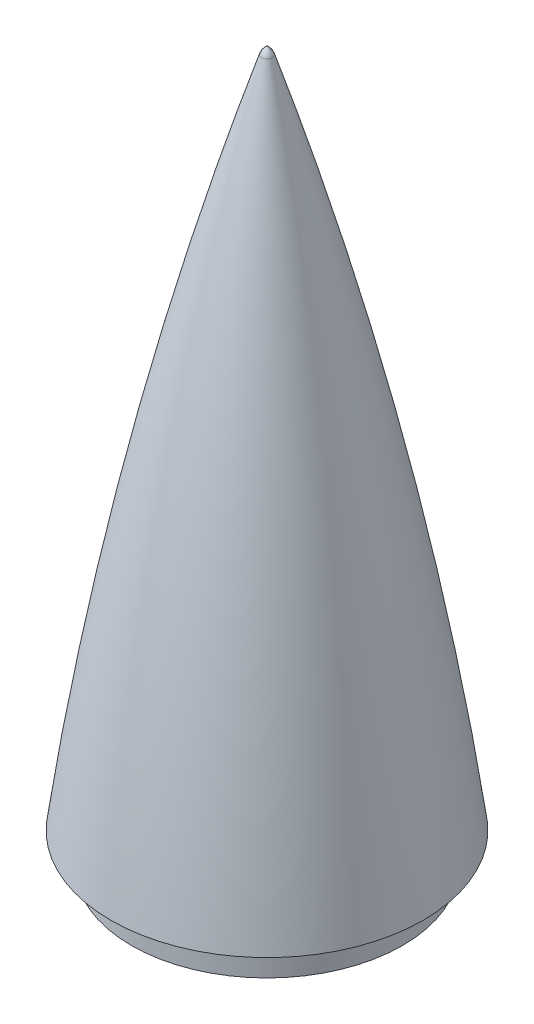
ISO-10303-21;
HEADER;
FILE_DESCRIPTION(('STEP AP214'),'2;1');
FILE_NAME('part.step','',(''),(''),'','','');
FILE_SCHEMA(('AUTOMOTIVE_DESIGN { 1 0 10303 214 1 1 1 1 }'));
ENDSEC;
DATA;
#1=APPLICATION_CONTEXT('core data for automotive mechanical design processes');
#2=APPLICATION_PROTOCOL_DEFINITION('international standard','automotive_design',2000,#1);
#3=PRODUCT_CONTEXT('',#1,'mechanical');
#4=PRODUCT('Part','Part','',(#3));
#5=PRODUCT_RELATED_PRODUCT_CATEGORY('part','',(#4));
#6=PRODUCT_DEFINITION_FORMATION('','',#4);
#7=PRODUCT_DEFINITION_CONTEXT('part definition',#1,'design');
#8=PRODUCT_DEFINITION('design','',#6,#7);
#9=PRODUCT_DEFINITION_SHAPE('','',#8);
#10=(LENGTH_UNIT() NAMED_UNIT(*) SI_UNIT(.MILLI.,.METRE.));
#11=(NAMED_UNIT(*) PLANE_ANGLE_UNIT() SI_UNIT($,.RADIAN.));
#12=(NAMED_UNIT(*) SI_UNIT($,.STERADIAN.) SOLID_ANGLE_UNIT());
#13=UNCERTAINTY_MEASURE_WITH_UNIT(LENGTH_MEASURE(1.E-05),#10,'distance_accuracy_value','');
#14=(GEOMETRIC_REPRESENTATION_CONTEXT(3) GLOBAL_UNCERTAINTY_ASSIGNED_CONTEXT((#13)) GLOBAL_UNIT_ASSIGNED_CONTEXT((#10,
#11,#12)) REPRESENTATION_CONTEXT('',''));
#15=CARTESIAN_POINT('',(0.,0.,0.));
#16=DIRECTION('',(0.,0.,1.));
#17=DIRECTION('',(1.,0.,0.));
#18=AXIS2_PLACEMENT_3D('',#15,#16,#17);
#19=CARTESIAN_POINT('',(0.,0.,0.));
#20=DIRECTION('',(0.,-1.,0.));
#21=DIRECTION('',(0.,0.,-1.));
#22=AXIS2_PLACEMENT_3D('',#19,#20,#21);
#23=DEGENERATE_TOROIDAL_SURFACE('',#22,1001.60919402985,1052.66319402985,.F.);
#24=CARTESIAN_POINT('',(0.,140.208,0.));
#25=DIRECTION('',(0.,-1.,0.));
#26=DIRECTION('',(0.,0.,-1.));
#27=AXIS2_PLACEMENT_3D('',#24,#25,#26);
#28=CIRCLE('',#27,41.674811790773);
#29=CARTESIAN_POINT('',(0.,140.208,-41.674811790773));
#30=VERTEX_POINT('',#29);
#31=EDGE_CURVE('E72',#30,#30,#28,.T.);
#32=ORIENTED_EDGE('',*,*,#31,.F.);
#33=EDGE_LOOP('',(#32));
#34=FACE_BOUND('',#33,.T.);
#35=CARTESIAN_POINT('',(0.,319.344549981105,0.));
#36=DIRECTION('',(0.,-1.,0.));
#37=DIRECTION('',(0.,0.,-1.));
#38=AXIS2_PLACEMENT_3D('',#35,#36,#37);
#39=CIRCLE('',#38,1.44556941155394);
#40=CARTESIAN_POINT('',(0.,319.344549981105,-1.44556941155394));
#41=VERTEX_POINT('',#40);
#42=EDGE_CURVE('E59',#41,#41,#39,.T.);
#43=ORIENTED_EDGE('',*,*,#42,.T.);
#44=EDGE_LOOP('',(#43));
#45=FACE_BOUND('',#44,.T.);
#46=ADVANCED_FACE('F34',(#34,#45),#23,.F.);
#47=CARTESIAN_POINT('',(0.,140.208,39.1119210511566));
#48=DIRECTION('',(0.,1.,0.));
#49=DIRECTION('',(0.,0.,1.));
#50=AXIS2_PLACEMENT_3D('',#47,#48,#49);
#51=PLANE('',#50);
#52=CARTESIAN_POINT('',(0.,140.208,0.));
#53=DIRECTION('',(0.,1.,0.));
#54=DIRECTION('',(0.,0.,1.));
#55=AXIS2_PLACEMENT_3D('',#52,#53,#54);
#56=CIRCLE('',#55,36.9169565238954);
#57=CARTESIAN_POINT('',(0.,140.208,36.9169565238954));
#58=VERTEX_POINT('',#57);
#59=EDGE_CURVE('E11',#58,#58,#56,.T.);
#60=ORIENTED_EDGE('',*,*,#59,.T.);
#61=EDGE_LOOP('',(#60));
#62=FACE_BOUND('',#61,.T.);
#63=ORIENTED_EDGE('',*,*,#31,.T.);
#64=EDGE_LOOP('',(#63));
#65=FACE_BOUND('',#64,.T.);
#66=ADVANCED_FACE('F89',(#62,#65),#51,.F.);
#67=CARTESIAN_POINT('',(0.,0.,0.));
#68=DIRECTION('',(0.,-1.,0.));
#69=DIRECTION('',(0.,0.,-1.));
#70=AXIS2_PLACEMENT_3D('',#67,#68,#69);
#71=CYLINDRICAL_SURFACE('',#70,36.1549565238954);
#72=CARTESIAN_POINT('',(0.,139.446,0.));
#73=DIRECTION('',(0.,1.,0.));
#74=DIRECTION('',(0.,0.,1.));
#75=AXIS2_PLACEMENT_3D('',#72,#73,#74);
#76=CIRCLE('',#75,36.1549565238954);
#77=CARTESIAN_POINT('',(0.,139.446,36.1549565238954));
#78=VERTEX_POINT('',#77);
#79=EDGE_CURVE('E42',#78,#78,#76,.F.);
#80=ORIENTED_EDGE('',*,*,#79,.T.);
#81=EDGE_LOOP('',(#80));
#82=FACE_BOUND('',#81,.T.);
#83=CARTESIAN_POINT('',(0.,131.601387737431,0.));
#84=DIRECTION('',(0.,-1.,0.));
#85=DIRECTION('',(0.,0.,-1.));
#86=AXIS2_PLACEMENT_3D('',#83,#84,#85);
#87=CIRCLE('',#86,36.1549565238954);
#88=CARTESIAN_POINT('',(0.,131.601387737431,-36.1549565238954));
#89=VERTEX_POINT('',#88);
#90=EDGE_CURVE('E69',#89,#89,#87,.T.);
#91=ORIENTED_EDGE('',*,*,#90,.F.);
#92=EDGE_LOOP('',(#91));
#93=FACE_BOUND('',#92,.T.);
#94=ADVANCED_FACE('F77',(#82,#93),#71,.T.);
#95=CARTESIAN_POINT('',(0.,131.601387737431,36.1549565238954));
#96=DIRECTION('',(0.,1.,0.));
#97=DIRECTION('',(0.,0.,1.));
#98=AXIS2_PLACEMENT_3D('',#95,#96,#97);
#99=PLANE('',#98);
#100=CARTESIAN_POINT('',(0.,131.601387737431,0.));
#101=DIRECTION('',(0.,-1.,0.));
#102=DIRECTION('',(0.,0.,-1.));
#103=AXIS2_PLACEMENT_3D('',#100,#101,#102);
#104=CIRCLE('',#103,33.6149565238954);
#105=CARTESIAN_POINT('',(0.,131.601387737431,-33.6149565238954));
#106=VERTEX_POINT('',#105);
#107=EDGE_CURVE('E62',#106,#106,#104,.T.);
#108=ORIENTED_EDGE('',*,*,#107,.F.);
#109=EDGE_LOOP('',(#108));
#110=FACE_BOUND('',#109,.T.);
#111=ORIENTED_EDGE('',*,*,#90,.T.);
#112=EDGE_LOOP('',(#111));
#113=FACE_BOUND('',#112,.T.);
#114=ADVANCED_FACE('F101',(#110,#113),#99,.F.);
#115=CARTESIAN_POINT('',(0.,0.,0.));
#116=DIRECTION('',(0.,-1.,0.));
#117=DIRECTION('',(0.,0.,-1.));
#118=AXIS2_PLACEMENT_3D('',#115,#116,#117);
#119=CYLINDRICAL_SURFACE('',#118,33.6149565238954);
#120=CARTESIAN_POINT('',(0.,142.748,0.));
#121=DIRECTION('',(0.,-1.,0.));
#122=DIRECTION('',(0.,0.,-1.));
#123=AXIS2_PLACEMENT_3D('',#120,#121,#122);
#124=CIRCLE('',#123,33.6149565238954);
#125=CARTESIAN_POINT('',(0.,142.748,-33.6149565238954));
#126=VERTEX_POINT('',#125);
#127=EDGE_CURVE('E58',#126,#126,#124,.T.);
#128=ORIENTED_EDGE('',*,*,#127,.F.);
#129=EDGE_LOOP('',(#128));
#130=FACE_BOUND('',#129,.T.);
#131=ORIENTED_EDGE('',*,*,#107,.T.);
#132=EDGE_LOOP('',(#131));
#133=FACE_BOUND('',#132,.T.);
#134=ADVANCED_FACE('F104',(#130,#133),#119,.F.);
#135=CARTESIAN_POINT('',(0.,142.748,0.));
#136=DIRECTION('',(0.,1.,0.));
#137=DIRECTION('',(0.,0.,1.));
#138=AXIS2_PLACEMENT_3D('',#135,#136,#137);
#139=CONICAL_SURFACE('',#138,33.6149565238954,1.04719755119663);
#140=CARTESIAN_POINT('',(0.,145.501978469614,0.));
#141=DIRECTION('',(0.,-1.,0.));
#142=DIRECTION('',(0.,0.,-1.));
#143=AXIS2_PLACEMENT_3D('',#140,#141,#142);
#144=CIRCLE('',#143,38.3849871562189);
#145=CARTESIAN_POINT('',(0.,145.501978469614,-38.3849871562189));
#146=VERTEX_POINT('',#145);
#147=EDGE_CURVE('E56',#146,#146,#144,.T.);
#148=ORIENTED_EDGE('',*,*,#147,.F.);
#149=EDGE_LOOP('',(#148));
#150=FACE_BOUND('',#149,.T.);
#151=ORIENTED_EDGE('',*,*,#127,.T.);
#152=EDGE_LOOP('',(#151));
#153=FACE_BOUND('',#152,.T.);
#154=ADVANCED_FACE('F52',(#150,#153),#139,.F.);
#155=CARTESIAN_POINT('',(0.,0.,1001.60919402985));
#156=DIRECTION('',(-1.,0.,0.));
#157=DIRECTION('',(0.,0.,-1.));
#158=AXIS2_PLACEMENT_3D('',#155,#156,#157);
#159=CIRCLE('',#158,1050.12319402985);
#160=TRIMMED_CURVE('',#159,(PARAMETER_VALUE(-0.305150955397003)),
(PARAMETER_VALUE(0.305150955397003)),.T.,.PARAMETER.);
#161=CARTESIAN_POINT('',(0.,0.,0.));
#162=DIRECTION('',(0.,-1.,0.));
#163=AXIS1_PLACEMENT('',#161,#162);
#164=SURFACE_OF_REVOLUTION('',#160,#163);
#165=CARTESIAN_POINT('',(0.,315.496030203754,2.22044604925031E-13));
#166=VERTEX_POINT('',#165);
#167=VERTEX_LOOP('',#166);
#168=FACE_BOUND('',#167,.T.);
#169=ORIENTED_EDGE('',*,*,#147,.T.);
#170=EDGE_LOOP('',(#169));
#171=FACE_BOUND('',#170,.T.);
#172=ADVANCED_FACE('F48',(#168,#171),#164,.F.);
#173=CARTESIAN_POINT('',(0.,318.188717097112,2.18487826666452));
#174=DIRECTION('',(-1.,0.,0.));
#175=DIRECTION('',(0.,0.,-1.));
#176=AXIS2_PLACEMENT_3D('',#173,#174,#175);
#177=CIRCLE('',#176,3.80999999999997);
#178=TRIMMED_CURVE('',#177,(PARAMETER_VALUE(-0.960074612382345)),
(PARAMETER_VALUE(0.960074612382345)),.T.,.PARAMETER.);
#179=CARTESIAN_POINT('',(0.,318.188717097112,0.));
#180=DIRECTION('',(0.,-1.,0.));
#181=AXIS1_PLACEMENT('',#179,#180);
#182=SURFACE_OF_REVOLUTION('',#178,#181);
#183=ORIENTED_EDGE('',*,*,#42,.F.);
#184=EDGE_LOOP('',(#183));
#185=FACE_BOUND('',#184,.T.);
#186=CARTESIAN_POINT('',(0.,321.31,0.));
#187=VERTEX_POINT('',#186);
#188=VERTEX_LOOP('',#187);
#189=FACE_BOUND('',#188,.T.);
#190=ADVANCED_FACE('F51',(#185,#189),#182,.T.);
#191=CARTESIAN_POINT('',(0.,139.446,0.));
#192=DIRECTION('',(0.,1.,0.));
#193=DIRECTION('',(0.,0.,1.));
#194=AXIS2_PLACEMENT_3D('',#191,#192,#193);
#195=TOROIDAL_SURFACE('',#194,36.9169565238954,0.762);
#196=ORIENTED_EDGE('',*,*,#59,.F.);
#197=EDGE_LOOP('',(#196));
#198=FACE_BOUND('',#197,.T.);
#199=ORIENTED_EDGE('',*,*,#79,.F.);
#200=EDGE_LOOP('',(#199));
#201=FACE_BOUND('',#200,.T.);
#202=ADVANCED_FACE('F36',(#198,#201),#195,.F.);
#203=CLOSED_SHELL('',(#46,#66,#94,#114,#134,#154,#172,#190,#202));
#204=MANIFOLD_SOLID_BREP('B2',#203);
#205=ADVANCED_BREP_SHAPE_REPRESENTATION('',(#18,#204),#14);
#206=SHAPE_DEFINITION_REPRESENTATION(#9,#205);
ENDSEC;
END-ISO-10303-21;
